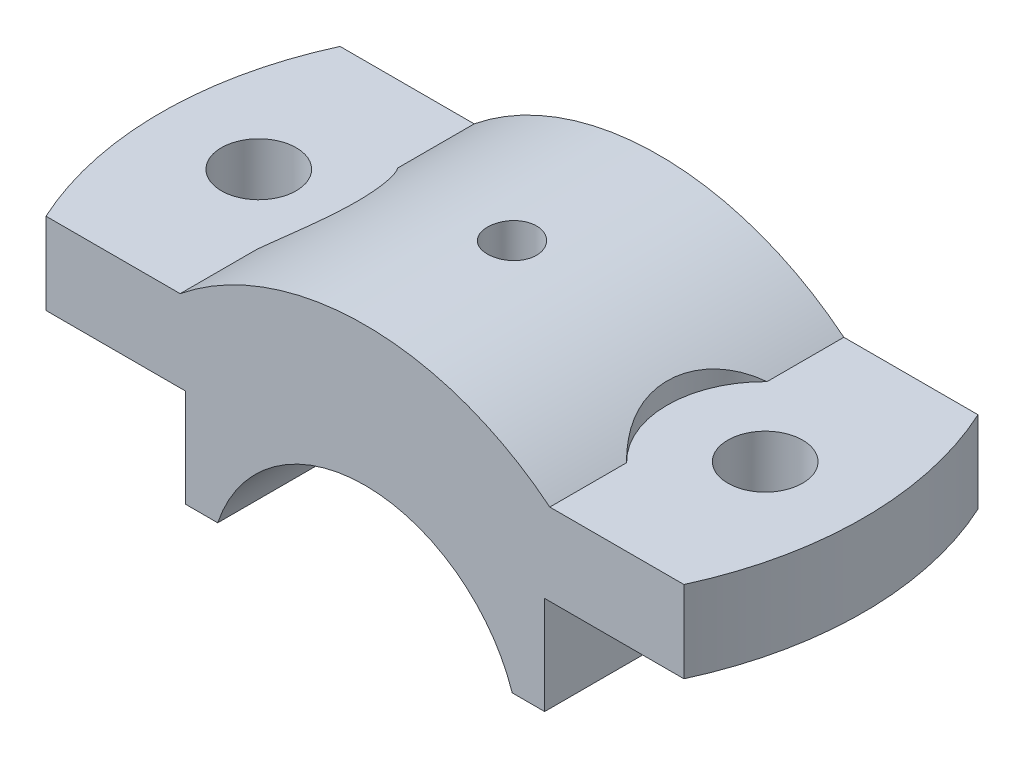
ISO-10303-21;
HEADER;
FILE_DESCRIPTION(('STEP AP214'),'2;1');
FILE_NAME('part.step','',(''),(''),'','','');
FILE_SCHEMA(('AUTOMOTIVE_DESIGN { 1 0 10303 214 1 1 1 1 }'));
ENDSEC;
DATA;
#1=APPLICATION_CONTEXT('core data for automotive mechanical design processes');
#2=APPLICATION_PROTOCOL_DEFINITION('international standard','automotive_design',2000,#1);
#3=PRODUCT_CONTEXT('',#1,'mechanical');
#4=PRODUCT('Part','Part','',(#3));
#5=PRODUCT_RELATED_PRODUCT_CATEGORY('part','',(#4));
#6=PRODUCT_DEFINITION_FORMATION('','',#4);
#7=PRODUCT_DEFINITION_CONTEXT('part definition',#1,'design');
#8=PRODUCT_DEFINITION('design','',#6,#7);
#9=PRODUCT_DEFINITION_SHAPE('','',#8);
#10=(LENGTH_UNIT() NAMED_UNIT(*) SI_UNIT(.MILLI.,.METRE.));
#11=(NAMED_UNIT(*) PLANE_ANGLE_UNIT() SI_UNIT($,.RADIAN.));
#12=(NAMED_UNIT(*) SI_UNIT($,.STERADIAN.) SOLID_ANGLE_UNIT());
#13=UNCERTAINTY_MEASURE_WITH_UNIT(LENGTH_MEASURE(1.E-05),#10,'distance_accuracy_value','');
#14=(GEOMETRIC_REPRESENTATION_CONTEXT(3) GLOBAL_UNCERTAINTY_ASSIGNED_CONTEXT((#13)) GLOBAL_UNIT_ASSIGNED_CONTEXT((#10,
#11,#12)) REPRESENTATION_CONTEXT('',''));
#15=CARTESIAN_POINT('',(0.,0.,0.));
#16=DIRECTION('',(0.,0.,1.));
#17=DIRECTION('',(1.,0.,0.));
#18=AXIS2_PLACEMENT_3D('',#15,#16,#17);
#19=CARTESIAN_POINT('',(0.,-19.,18.));
#20=DIRECTION('',(0.,0.,-1.));
#21=DIRECTION('',(-1.,0.,0.));
#22=AXIS2_PLACEMENT_3D('',#19,#20,#21);
#23=CYLINDRICAL_SURFACE('',#22,36.);
#24=CARTESIAN_POINT('',(0.,17.,3.));
#25=CARTESIAN_POINT('',(-0.168198269763613,16.9999983623455,2.99999265352116));
#26=CARTESIAN_POINT('',(-0.336511041540677,16.9988086563019,2.98580709056686));
#27=CARTESIAN_POINT('',(-0.668479712101169,16.9941770698475,2.92942694443476));
#28=CARTESIAN_POINT('',(-0.832130115675691,16.9907326379509,2.88720062908529));
#29=CARTESIAN_POINT('',(-1.14991806754278,16.9819808373831,2.7759685385719));
#30=CARTESIAN_POINT('',(-1.30406094127385,16.9766745229546,2.70697791567055));
#31=CARTESIAN_POINT('',(-1.59854170024823,16.9647940323414,2.54420270438402));
#32=CARTESIAN_POINT('',(-1.73888252965617,16.9582201274407,2.45042341956747));
#33=CARTESIAN_POINT('',(-2.00216999989677,16.9445233960014,2.24047480018201));
#34=CARTESIAN_POINT('',(-2.12507661724848,16.9373993625973,2.12425534819294));
#35=CARTESIAN_POINT('',(-2.34966340060966,16.9234154240951,1.8728313124502));
#36=CARTESIAN_POINT('',(-2.45134263411452,16.9165555306112,1.73762589509213));
#37=CARTESIAN_POINT('',(-2.63072376717069,16.9038635798373,1.45182564870291));
#38=CARTESIAN_POINT('',(-2.70839049885463,16.8980330354028,1.30120867379168));
#39=CARTESIAN_POINT('',(-2.83731730132153,16.8880737334482,0.989015113332052));
#40=CARTESIAN_POINT('',(-2.88857783853725,16.883944945869,0.827438721425248));
#41=CARTESIAN_POINT('',(-2.96312108945571,16.8778667619897,0.498313824356467));
#42=CARTESIAN_POINT('',(-2.98646899616932,16.8759122880866,0.330780180022194));
#43=CARTESIAN_POINT('',(-3.00472562404628,16.8743879696443,-0.00583861183609764));
#44=CARTESIAN_POINT('',(-2.99963487893862,16.8748180803518,-0.174923730183009));
#45=CARTESIAN_POINT('',(-2.96121259264454,16.8780097208491,-0.509398996531564));
#46=CARTESIAN_POINT('',(-2.92795190411417,16.8807654013356,-0.674797347229238));
#47=CARTESIAN_POINT('',(-2.83424395614882,16.888288507081,-0.99765560217886));
#48=CARTESIAN_POINT('',(-2.77379643119035,16.893055951988,-1.15511542888156));
#49=CARTESIAN_POINT('',(-2.6273513644561,16.9040721412056,-1.45785271763429));
#50=CARTESIAN_POINT('',(-2.54132203427158,16.9103227265289,-1.60311473276253));
#51=CARTESIAN_POINT('',(-2.34617833174004,16.9235992059164,-1.87716401645942));
#52=CARTESIAN_POINT('',(-2.23706349186763,16.9306251156809,-2.00595095129165));
#53=CARTESIAN_POINT('',(-1.99844874667909,16.9446866123494,-2.2438062578447));
#54=CARTESIAN_POINT('',(-1.86888758817172,16.951722163252,-2.35281319238775));
#55=CARTESIAN_POINT('',(-1.59327166911525,16.964989756095,-2.54753917016566));
#56=CARTESIAN_POINT('',(-1.44721689754601,16.9712217974986,-2.63325819784067));
#57=CARTESIAN_POINT('',(-1.14271977980355,16.9821813742892,-2.77897128800612));
#58=CARTESIAN_POINT('',(-0.984276125427222,16.9869087505233,-2.83896262943447));
#59=CARTESIAN_POINT('',(-0.659517207058746,16.9943245223539,-2.93147439735398));
#60=CARTESIAN_POINT('',(-0.493202106506565,16.9970129602666,-2.96399539396579));
#61=CARTESIAN_POINT('',(-0.157953900492752,17.0000425082915,-3.00056629212474));
#62=CARTESIAN_POINT('',(0.0109698873455888,17.0003906147601,-3.00470105432069));
#63=CARTESIAN_POINT('',(0.347108257509911,16.998718963361,-2.98460441811805));
#64=CARTESIAN_POINT('',(0.51432285576424,16.9966992275802,-2.96037328431162));
#65=CARTESIAN_POINT('',(0.842054268674099,16.9905235352396,-2.88430302416972));
#66=CARTESIAN_POINT('',(1.00258027541917,16.9863706225226,-2.83250323192257));
#67=CARTESIAN_POINT('',(1.31266249524747,16.9763951033705,-2.70280623665391));
#68=CARTESIAN_POINT('',(1.4622185348494,16.9705724705373,-2.6249086210245));
#69=CARTESIAN_POINT('',(1.74650165490572,16.957892791809,-2.44501395235093));
#70=CARTESIAN_POINT('',(1.88119305156441,16.9510333465621,-2.34296068081552));
#71=CARTESIAN_POINT('',(2.13156328453086,16.9370587591909,-2.11773282884855));
#72=CARTESIAN_POINT('',(2.24724179044315,16.9299436126258,-1.9945578814522));
#73=CARTESIAN_POINT('',(2.45659363636531,16.9162388364747,-1.73021492340498));
#74=CARTESIAN_POINT('',(2.55021159970092,16.9096505562267,-1.5890029764078));
#75=CARTESIAN_POINT('',(2.71240518851855,16.8977645523296,-1.29281321140975));
#76=CARTESIAN_POINT('',(2.78098106402989,16.8924668157955,-1.13783553087018));
#77=CARTESIAN_POINT('',(2.89104953232169,16.8837692854682,-0.818709628382284));
#78=CARTESIAN_POINT('',(2.93257602434787,16.880367116859,-0.654573165857006));
#79=CARTESIAN_POINT('',(2.98747730973046,16.8758379707255,-0.321627900376726));
#80=CARTESIAN_POINT('',(3.0008526437048,16.8747109495091,-0.152819187211215));
#81=CARTESIAN_POINT('',(2.99906568867279,16.8748603385058,0.184128378062687));
#82=CARTESIAN_POINT('',(2.98399040933217,16.8761294207921,0.352267701709314));
#83=CARTESIAN_POINT('',(2.92591158988509,16.8809124524692,0.683617600652554));
#84=CARTESIAN_POINT('',(2.88290800718288,16.8844264052839,0.84682816843152));
#85=CARTESIAN_POINT('',(2.77021533005119,16.8933013139512,1.16369328979986));
#86=CARTESIAN_POINT('',(2.7005278020196,16.8986621613857,1.31734840369706));
#87=CARTESIAN_POINT('',(2.53645517684175,16.9106269962521,1.610792521721));
#88=CARTESIAN_POINT('',(2.44207046734367,16.9172309641714,1.75058174343998));
#89=CARTESIAN_POINT('',(2.23095582636734,16.9309619509604,2.01277121703903));
#90=CARTESIAN_POINT('',(2.11416148122438,16.9380904401723,2.13511952597204));
#91=CARTESIAN_POINT('',(1.86165967677739,16.9520538502904,2.35852555560996));
#92=CARTESIAN_POINT('',(1.72594764792327,16.9588886997447,2.45957811748805));
#93=CARTESIAN_POINT('',(1.43920131908824,16.9715070452682,2.63765958125269));
#94=CARTESIAN_POINT('',(1.28813896881161,16.9772885606931,2.71464341596898));
#95=CARTESIAN_POINT('',(0.975287255987198,16.987125575489,2.84205540915384));
#96=CARTESIAN_POINT('',(0.813510466240951,16.9911830578477,2.89251409286432));
#97=CARTESIAN_POINT('',(0.542316144290037,16.9960732320155,2.95259274750614));
#98=CARTESIAN_POINT('',(0.43464268331541,16.9975390663086,2.97034683755247));
#99=CARTESIAN_POINT('',(0.217995514503486,16.999502979759,2.99405282903161));
#100=CARTESIAN_POINT('',(0.109021810119134,17.0000010614857,3.00000476179941));
#101=CARTESIAN_POINT('',(0.,17.,3.));
#102=B_SPLINE_CURVE_WITH_KNOTS('',3,(#24,#25,#26,#27,#28,#29,#30,#31,#32,#33,#34,#35,#36,#37,
#38,#39,#40,#41,#42,#43,#44,#45,#46,#47,#48,#49,#50,#51,#52,#53,#54,#55,#56,#57,#58,#59,#60,#61,
#62,#63,#64,#65,#66,#67,#68,#69,#70,#71,#72,#73,#74,#75,#76,#77,#78,#79,#80,#81,#82,#83,#84,#85,
#86,#87,#88,#89,#90,#91,#92,#93,#94,#95,#96,#97,#98,#99,#100,#101),.UNSPECIFIED.,.T.,.F.,(4,2,2,
2,2,2,2,2,2,2,2,2,2,2,2,2,2,2,2,2,2,2,2,2,2,2,2,2,2,2,2,2,2,2,2,2,2,2,4),(0.,0.504196760400417,
1.00896506699351,1.51344802166686,2.01782312875254,2.52333800635729,3.02887508621795,
3.53514908853274,4.04141414783703,4.54649444494759,5.05156526287857,5.55536949330869,
6.05917864430997,6.56361647246698,7.0680645174258,7.57405352805448,8.08004287675934,
8.58608572771351,9.09211807597605,9.59663697921506,10.1011511764266,10.6049474709236,
11.1087517308412,11.6137402492478,12.1187375421375,12.6249892947361,13.1312359925948,
13.6368470172279,14.1424483319627,14.6465058864758,15.1505642097702,15.6545929484257,
16.1586137762957,16.6641056599392,17.1697198569744,17.6762751918766,18.1822462977536,
18.5090545906999,18.8358620159624),.UNSPECIFIED.);
#103=CARTESIAN_POINT('',(0.,17.,3.));
#104=VERTEX_POINT('',#103);
#105=EDGE_CURVE('E12',#104,#104,#102,.T.);
#106=ORIENTED_EDGE('',*,*,#105,.T.);
#107=EDGE_LOOP('',(#106));
#108=FACE_BOUND('',#107,.T.);
#109=CARTESIAN_POINT('',(-22.6274169979695,8.99999999999999,8.59337023312926));
#110=CARTESIAN_POINT('',(-22.4323020377035,9.15770103038517,8.40332361079073));
#111=CARTESIAN_POINT('',(-22.2409672164458,9.30892675659083,8.20389961009321));
#112=CARTESIAN_POINT('',(-21.8681145773808,9.59791732158841,7.78671256886573));
#113=CARTESIAN_POINT('',(-21.686602145838,9.73567480759426,7.56893963045307));
#114=CARTESIAN_POINT('',(-21.335424923114,9.99737627889387,7.11510533494271));
#115=CARTESIAN_POINT('',(-21.1657912246189,10.1212844839164,6.87899916090791));
#116=CARTESIAN_POINT('',(-20.8412794940323,10.3544028545234,6.39004040968228));
#117=CARTESIAN_POINT('',(-20.6863986754628,10.4636157973175,6.13719101025455));
#118=CARTESIAN_POINT('',(-20.3930805972417,10.6673945383296,5.61510434153096));
#119=CARTESIAN_POINT('',(-20.254705932235,10.7619049693274,5.34581020154524));
#120=CARTESIAN_POINT('',(-19.9971626484115,10.9355579229168,4.79339154830518));
#121=CARTESIAN_POINT('',(-19.8779954688237,11.014699293986,4.51026600072419));
#122=CARTESIAN_POINT('',(-19.6609097170449,11.1573455166117,3.93271050943543));
#123=CARTESIAN_POINT('',(-19.5629574655434,11.2208751741242,3.63829936972604));
#124=CARTESIAN_POINT('',(-19.3896076627572,11.3323879083536,3.04005208816817));
#125=CARTESIAN_POINT('',(-19.3142084052037,11.3803721611964,2.73621666124398));
#126=CARTESIAN_POINT('',(-19.19108708929,11.4582852979445,2.14065405031052));
#127=CARTESIAN_POINT('',(-19.1419399628041,11.4891484476322,1.84934258858535));
#128=CARTESIAN_POINT('',(-19.0652179392428,11.5371826320701,1.2627784342351));
#129=CARTESIAN_POINT('',(-19.0376422820532,11.5543541492732,0.967525880855281));
#130=CARTESIAN_POINT('',(-19.0044417350915,11.5750155819116,0.375193052705737));
#131=CARTESIAN_POINT('',(-18.9988257690714,11.5784999353017,0.0781120840294408));
#132=CARTESIAN_POINT('',(-19.0096479738256,11.5717733571517,-0.515490882076435));
#133=CARTESIAN_POINT('',(-19.0260858170253,11.5615626290305,-0.812012887743021));
#134=CARTESIAN_POINT('',(-19.0798854563829,11.5280023986573,-1.39255450329964));
#135=CARTESIAN_POINT('',(-19.1165435736388,11.50509463797,-1.67666527978511));
#136=CARTESIAN_POINT('',(-19.2097910626555,11.4464604968196,-2.24024684656919));
#137=CARTESIAN_POINT('',(-19.2663799084814,11.4107344546067,-2.51971775910146));
#138=CARTESIAN_POINT('',(-19.3987244028512,11.3264840246874,-3.07199714482626));
#139=CARTESIAN_POINT('',(-19.4744729165682,11.2779644008699,-3.34480805674543));
#140=CARTESIAN_POINT('',(-19.6441602685364,11.1681482759089,-3.88206436777503));
#141=CARTESIAN_POINT('',(-19.7380990781002,11.1068517949154,-4.14650978007758));
#142=CARTESIAN_POINT('',(-19.9440381230947,10.9708311545791,-4.66811676469057));
#143=CARTESIAN_POINT('',(-20.0562187233289,10.8959719501222,-4.92517184104498));
#144=CARTESIAN_POINT('',(-20.2964661342034,10.7333901526991,-5.42752729888821));
#145=CARTESIAN_POINT('',(-20.4245339564462,10.645666740553,-5.67282693048118));
#146=CARTESIAN_POINT('',(-20.6949566664005,10.4575268356823,-6.15041122627124));
#147=CARTESIAN_POINT('',(-20.8373150097059,10.3571072713679,-6.38269272128765));
#148=CARTESIAN_POINT('',(-21.1344883115375,10.1438989248369,-6.83305433090923));
#149=CARTESIAN_POINT('',(-21.2893004878411,10.0311129032902,-7.05113759785105));
#150=CARTESIAN_POINT('',(-21.6338337672899,9.77550813546387,-7.50425353527947));
#151=CARTESIAN_POINT('',(-21.8252948316158,9.63072656374516,-7.736867214541));
#152=CARTESIAN_POINT('',(-22.120632533989,9.40234283341371,-8.07000459877512));
#153=CARTESIAN_POINT('',(-22.220302245267,9.32445409032998,-8.17829024018718));
#154=CARTESIAN_POINT('',(-22.4220958340157,9.16498114963709,-8.38969961746407));
#155=CARTESIAN_POINT('',(-22.5242193974326,9.08339742375647,-8.49282400873301));
#156=CARTESIAN_POINT('',(-22.6274169979695,8.99999999999999,-8.59337023312926));
#157=B_SPLINE_CURVE_WITH_KNOTS('',3,(#109,#110,#111,#112,#113,#114,#115,#116,#117,#118,#119,
#120,#121,#122,#123,#124,#125,#126,#127,#128,#129,#130,#131,#132,#133,#134,#135,#136,#137,#138,
#139,#140,#141,#142,#143,#144,#145,#146,#147,#148,#149,#150,#151,#152,#153,#154,#155,#156),
.UNSPECIFIED.,.F.,.F.,(4,2,2,2,2,2,2,2,2,2,2,2,2,2,2,2,2,2,2,2,2,2,2,4),(0.,0.944085832178336,
1.88868422919986,2.83566922749357,3.78247500606206,4.73276421628001,5.6831245991925,
6.63196501545618,7.58073362809563,8.4707346614709,9.36070433244542,10.2510356225207,
11.1413536882697,12.0024819160299,12.8635874219137,13.7243727334926,14.5851566875723,
15.4550364955656,16.324971720713,17.1951178141404,18.0650700513922,19.0664887963157,
19.565910614532,20.065268851649),.UNSPECIFIED.);
#158=CARTESIAN_POINT('',(-22.6274169979695,8.99999999999999,8.59337023312926));
#159=VERTEX_POINT('',#158);
#160=CARTESIAN_POINT('',(-22.6274169979695,8.99999999999999,-8.59337023312926));
#161=VERTEX_POINT('',#160);
#162=EDGE_CURVE('E58',#159,#161,#157,.T.);
#163=ORIENTED_EDGE('',*,*,#162,.F.);
#164=DIRECTION('',(0.,0.,-1.));
#165=VECTOR('',#164,1.);
#166=CARTESIAN_POINT('',(-22.6274169979695,8.99999999999999,18.));
#167=LINE('',#166,#165);
#168=CARTESIAN_POINT('',(-22.6274169979695,8.99999999999999,18.));
#169=VERTEX_POINT('',#168);
#170=EDGE_CURVE('E159',#169,#159,#167,.T.);
#171=ORIENTED_EDGE('',*,*,#170,.F.);
#172=CARTESIAN_POINT('',(0.,-19.,18.));
#173=DIRECTION('',(0.,0.,1.));
#174=DIRECTION('',(-1.,0.,0.));
#175=AXIS2_PLACEMENT_3D('',#172,#173,#174);
#176=CIRCLE('',#175,36.);
#177=CARTESIAN_POINT('',(22.6274169979695,8.99999999999999,18.));
#178=VERTEX_POINT('',#177);
#179=EDGE_CURVE('E358',#178,#169,#176,.T.);
#180=ORIENTED_EDGE('',*,*,#179,.F.);
#181=DIRECTION('',(0.,0.,-1.));
#182=VECTOR('',#181,1.);
#183=CARTESIAN_POINT('',(22.6274169979695,8.99999999999999,18.));
#184=LINE('',#183,#182);
#185=CARTESIAN_POINT('',(22.6274169979695,8.99999999999999,8.59337023312925));
#186=VERTEX_POINT('',#185);
#187=EDGE_CURVE('E174',#178,#186,#184,.T.);
#188=ORIENTED_EDGE('',*,*,#187,.T.);
#189=CARTESIAN_POINT('',(22.6274169979695,8.99999999999999,-8.59337023312927));
#190=CARTESIAN_POINT('',(22.4323020377035,9.15770103038517,-8.40332361079075));
#191=CARTESIAN_POINT('',(22.2409672164458,9.30892675659083,-8.20389961009323));
#192=CARTESIAN_POINT('',(21.8681145773808,9.59791732158841,-7.78671256886575));
#193=CARTESIAN_POINT('',(21.686602145838,9.73567480759427,-7.56893963045309));
#194=CARTESIAN_POINT('',(21.335424923114,9.99737627889387,-7.11510533494273));
#195=CARTESIAN_POINT('',(21.1657912246189,10.1212844839164,-6.87899916090793));
#196=CARTESIAN_POINT('',(20.8412794940323,10.3544028545234,-6.3900404096823));
#197=CARTESIAN_POINT('',(20.6863986754628,10.4636157973175,-6.13719101025457));
#198=CARTESIAN_POINT('',(20.3930805972417,10.6673945383296,-5.61510434153098));
#199=CARTESIAN_POINT('',(20.254705932235,10.7619049693274,-5.34581020154526));
#200=CARTESIAN_POINT('',(19.9971626484115,10.9355579229168,-4.79339154830519));
#201=CARTESIAN_POINT('',(19.8779954688237,11.014699293986,-4.51026600072421));
#202=CARTESIAN_POINT('',(19.6609097170449,11.1573455166117,-3.93271050943544));
#203=CARTESIAN_POINT('',(19.5629574655434,11.2208751741242,-3.63829936972605));
#204=CARTESIAN_POINT('',(19.3896076627572,11.3323879083536,-3.04005208816818));
#205=CARTESIAN_POINT('',(19.3142084052037,11.3803721611964,-2.736216661244));
#206=CARTESIAN_POINT('',(19.19108708929,11.4582852979445,-2.14065405031054));
#207=CARTESIAN_POINT('',(19.1419399628041,11.4891484476322,-1.84934258858536));
#208=CARTESIAN_POINT('',(19.0652179392428,11.5371826320701,-1.26277843423512));
#209=CARTESIAN_POINT('',(19.0376422820532,11.5543541492732,-0.967525880855294));
#210=CARTESIAN_POINT('',(19.0044417350915,11.5750155819116,-0.375193052705747));
#211=CARTESIAN_POINT('',(18.9988257690714,11.5784999353017,-0.0781120840294504));
#212=CARTESIAN_POINT('',(19.0096479738256,11.5717733571517,0.515490882076427));
#213=CARTESIAN_POINT('',(19.0260858170253,11.5615626290305,0.812012887743013));
#214=CARTESIAN_POINT('',(19.0798854563829,11.5280023986573,1.39255450329963));
#215=CARTESIAN_POINT('',(19.1165435736387,11.50509463797,1.67666527978511));
#216=CARTESIAN_POINT('',(19.2097910626555,11.4464604968196,2.24024684656919));
#217=CARTESIAN_POINT('',(19.2663799084814,11.4107344546067,2.51971775910146));
#218=CARTESIAN_POINT('',(19.3987244028512,11.3264840246874,3.07199714482625));
#219=CARTESIAN_POINT('',(19.4744729165682,11.2779644008699,3.34480805674543));
#220=CARTESIAN_POINT('',(19.6441602685364,11.1681482759089,3.88206436777502));
#221=CARTESIAN_POINT('',(19.7380990781002,11.1068517949154,4.14650978007757));
#222=CARTESIAN_POINT('',(19.9440381230947,10.9708311545791,4.66811676469057));
#223=CARTESIAN_POINT('',(20.0562187233289,10.8959719501222,4.92517184104498));
#224=CARTESIAN_POINT('',(20.2964661342034,10.7333901526991,5.42752729888821));
#225=CARTESIAN_POINT('',(20.4245339564462,10.645666740553,5.67282693048118));
#226=CARTESIAN_POINT('',(20.6949566664005,10.4575268356823,6.15041122627124));
#227=CARTESIAN_POINT('',(20.8373150097059,10.3571072713679,6.38269272128765));
#228=CARTESIAN_POINT('',(21.1344883115375,10.1438989248369,6.83305433090923));
#229=CARTESIAN_POINT('',(21.2893004878411,10.0311129032902,7.05113759785105));
#230=CARTESIAN_POINT('',(21.6338337672899,9.77550813546387,7.50425353527946));
#231=CARTESIAN_POINT('',(21.8252948316158,9.63072656374516,7.736867214541));
#232=CARTESIAN_POINT('',(22.120632533989,9.40234283341371,8.07000459877512));
#233=CARTESIAN_POINT('',(22.220302245267,9.32445409032999,8.17829024018718));
#234=CARTESIAN_POINT('',(22.4220958340157,9.16498114963709,8.38969961746406));
#235=CARTESIAN_POINT('',(22.5242193974326,9.08339742375647,8.492824008733));
#236=CARTESIAN_POINT('',(22.6274169979695,8.99999999999999,8.59337023312925));
#237=B_SPLINE_CURVE_WITH_KNOTS('',3,(#189,#190,#191,#192,#193,#194,#195,#196,#197,#198,#199,
#200,#201,#202,#203,#204,#205,#206,#207,#208,#209,#210,#211,#212,#213,#214,#215,#216,#217,#218,
#219,#220,#221,#222,#223,#224,#225,#226,#227,#228,#229,#230,#231,#232,#233,#234,#235,#236),
.UNSPECIFIED.,.F.,.F.,(4,2,2,2,2,2,2,2,2,2,2,2,2,2,2,2,2,2,2,2,2,2,2,4),(0.,0.944085832178336,
1.88868422919986,2.83566922749357,3.78247500606207,4.73276421628001,5.68312459919251,
6.63196501545619,7.58073362809564,8.47073466147091,9.36070433244543,10.2510356225207,
11.1413536882697,12.0024819160299,12.8635874219138,13.7243727334926,14.5851566875724,
15.4550364955656,16.324971720713,17.1951178141404,18.0650700513922,19.0664887963157,
19.565910614532,20.065268851649),.UNSPECIFIED.);
#238=CARTESIAN_POINT('',(22.6274169979695,8.99999999999998,-8.59337023312927));
#239=VERTEX_POINT('',#238);
#240=EDGE_CURVE('E164',#239,#186,#237,.T.);
#241=ORIENTED_EDGE('',*,*,#240,.F.);
#242=CARTESIAN_POINT('',(22.6274169979695,8.99999999999999,-18.));
#243=VERTEX_POINT('',#242);
#244=EDGE_CURVE('E170',#239,#243,#184,.T.);
#245=ORIENTED_EDGE('',*,*,#244,.T.);
#246=CARTESIAN_POINT('',(0.,-19.,-18.));
#247=DIRECTION('',(0.,0.,1.));
#248=DIRECTION('',(-1.,0.,0.));
#249=AXIS2_PLACEMENT_3D('',#246,#247,#248);
#250=CIRCLE('',#249,36.);
#251=CARTESIAN_POINT('',(-22.6274169979695,8.99999999999999,-18.));
#252=VERTEX_POINT('',#251);
#253=EDGE_CURVE('E390',#243,#252,#250,.T.);
#254=ORIENTED_EDGE('',*,*,#253,.T.);
#255=EDGE_CURVE('E162',#161,#252,#167,.T.);
#256=ORIENTED_EDGE('',*,*,#255,.F.);
#257=EDGE_LOOP('',(#163,#171,#180,#188,#241,#245,#254,#256));
#258=FACE_BOUND('',#257,.T.);
#259=ADVANCED_FACE('F44',(#108,#258),#23,.T.);
#260=CARTESIAN_POINT('',(21.9977563773199,-1.00000000000001,18.));
#261=DIRECTION('',(0.,1.,0.));
#262=DIRECTION('',(0.,0.,1.));
#263=AXIS2_PLACEMENT_3D('',#260,#261,#262);
#264=PLANE('',#263);
#265=CARTESIAN_POINT('',(31.,-1.00000000000001,0.));
#266=DIRECTION('',(0.,1.,0.));
#267=DIRECTION('',(0.,0.,1.));
#268=AXIS2_PLACEMENT_3D('',#265,#266,#267);
#269=CIRCLE('',#268,4.57770557858712);
#270=CARTESIAN_POINT('',(31.,-1.00000000000001,4.57770557858712));
#271=VERTEX_POINT('',#270);
#272=EDGE_CURVE('E206',#271,#271,#269,.T.);
#273=ORIENTED_EDGE('',*,*,#272,.T.);
#274=EDGE_LOOP('',(#273));
#275=FACE_BOUND('',#274,.T.);
#276=CARTESIAN_POINT('',(0.,-1.00000000000001,0.));
#277=DIRECTION('',(0.,1.,0.));
#278=DIRECTION('',(0.,0.,1.));
#279=AXIS2_PLACEMENT_3D('',#276,#277,#278);
#280=CIRCLE('',#279,42.9977563773199);
#281=CARTESIAN_POINT('',(39.0487778743888,-1.00000000000001,18.));
#282=VERTEX_POINT('',#281);
#283=CARTESIAN_POINT('',(39.0487778743888,-1.00000000000001,-18.));
#284=VERTEX_POINT('',#283);
#285=EDGE_CURVE('E327',#282,#284,#280,.T.);
#286=ORIENTED_EDGE('',*,*,#285,.F.);
#287=DIRECTION('',(1.,0.,0.));
#288=VECTOR('',#287,1.);
#289=CARTESIAN_POINT('',(21.9977563773199,-1.00000000000001,18.));
#290=LINE('',#289,#288);
#291=CARTESIAN_POINT('',(21.9977563773199,-1.00000000000001,18.));
#292=VERTEX_POINT('',#291);
#293=EDGE_CURVE('E351',#292,#282,#290,.T.);
#294=ORIENTED_EDGE('',*,*,#293,.F.);
#295=DIRECTION('',(0.,0.,-1.));
#296=VECTOR('',#295,1.);
#297=CARTESIAN_POINT('',(21.9977563773199,-1.00000000000001,18.));
#298=LINE('',#297,#296);
#299=CARTESIAN_POINT('',(21.9977563773199,-1.00000000000001,-18.));
#300=VERTEX_POINT('',#299);
#301=EDGE_CURVE('E182',#292,#300,#298,.T.);
#302=ORIENTED_EDGE('',*,*,#301,.T.);
#303=DIRECTION('',(1.,0.,0.));
#304=VECTOR('',#303,1.);
#305=CARTESIAN_POINT('',(21.9977563773199,-1.00000000000001,-18.));
#306=LINE('',#305,#304);
#307=EDGE_CURVE('E382',#300,#284,#306,.T.);
#308=ORIENTED_EDGE('',*,*,#307,.T.);
#309=EDGE_LOOP('',(#286,#294,#302,#308));
#310=FACE_BOUND('',#309,.T.);
#311=ADVANCED_FACE('F267',(#275,#310),#264,.F.);
#312=CARTESIAN_POINT('',(42.9977563773199,8.99999999999999,18.));
#313=DIRECTION('',(0.,-1.,0.));
#314=DIRECTION('',(1.,0.,0.));
#315=AXIS2_PLACEMENT_3D('',#312,#313,#314);
#316=PLANE('',#315);
#317=CARTESIAN_POINT('',(31.,8.99999999999998,0.));
#318=DIRECTION('',(0.,1.,0.));
#319=DIRECTION('',(1.,0.,0.));
#320=AXIS2_PLACEMENT_3D('',#317,#318,#319);
#321=CIRCLE('',#320,4.57770557858712);
#322=CARTESIAN_POINT('',(35.5777055785871,8.99999999999998,0.));
#323=VERTEX_POINT('',#322);
#324=EDGE_CURVE('E154',#323,#323,#321,.T.);
#325=ORIENTED_EDGE('',*,*,#324,.F.);
#326=EDGE_LOOP('',(#325));
#327=FACE_BOUND('',#326,.T.);
#328=CARTESIAN_POINT('',(0.,8.99999999999999,0.));
#329=DIRECTION('',(0.,1.,0.));
#330=DIRECTION('',(-1.,0.,0.));
#331=AXIS2_PLACEMENT_3D('',#328,#329,#330);
#332=CIRCLE('',#331,42.9977563773199);
#333=CARTESIAN_POINT('',(39.0487778743888,8.99999999999998,18.));
#334=VERTEX_POINT('',#333);
#335=CARTESIAN_POINT('',(39.0487778743888,8.99999999999998,-18.));
#336=VERTEX_POINT('',#335);
#337=EDGE_CURVE('E323',#334,#336,#332,.T.);
#338=ORIENTED_EDGE('',*,*,#337,.T.);
#339=DIRECTION('',(-1.,0.,0.));
#340=VECTOR('',#339,1.);
#341=CARTESIAN_POINT('',(42.9977563773199,8.99999999999999,-18.));
#342=LINE('',#341,#340);
#343=EDGE_CURVE('E386',#336,#243,#342,.T.);
#344=ORIENTED_EDGE('',*,*,#343,.T.);
#345=ORIENTED_EDGE('',*,*,#244,.F.);
#346=CARTESIAN_POINT('',(31.,8.99999999999998,0.));
#347=DIRECTION('',(0.,1.,0.));
#348=DIRECTION('',(1.,0.,0.));
#349=AXIS2_PLACEMENT_3D('',#346,#347,#348);
#350=CIRCLE('',#349,11.9977563773199);
#351=EDGE_CURVE('E65',#239,#186,#350,.T.);
#352=ORIENTED_EDGE('',*,*,#351,.T.);
#353=ORIENTED_EDGE('',*,*,#187,.F.);
#354=DIRECTION('',(-1.,0.,0.));
#355=VECTOR('',#354,1.);
#356=CARTESIAN_POINT('',(42.9977563773199,8.99999999999999,18.));
#357=LINE('',#356,#355);
#358=EDGE_CURVE('E355',#334,#178,#357,.T.);
#359=ORIENTED_EDGE('',*,*,#358,.F.);
#360=EDGE_LOOP('',(#338,#344,#345,#352,#353,#359));
#361=FACE_BOUND('',#360,.T.);
#362=ADVANCED_FACE('F262',(#327,#361),#316,.F.);
#363=CARTESIAN_POINT('',(-42.9977563773199,8.99999999999999,18.));
#364=DIRECTION('',(0.,-1.,0.));
#365=DIRECTION('',(1.,0.,0.));
#366=AXIS2_PLACEMENT_3D('',#363,#364,#365);
#367=PLANE('',#366);
#368=CARTESIAN_POINT('',(-31.,8.99999999999999,0.));
#369=DIRECTION('',(0.,1.,0.));
#370=DIRECTION('',(-1.,0.,0.));
#371=AXIS2_PLACEMENT_3D('',#368,#369,#370);
#372=CIRCLE('',#371,4.57770557858712);
#373=CARTESIAN_POINT('',(-35.5777055785871,8.99999999999999,0.));
#374=VERTEX_POINT('',#373);
#375=EDGE_CURVE('E207',#374,#374,#372,.T.);
#376=ORIENTED_EDGE('',*,*,#375,.F.);
#377=EDGE_LOOP('',(#376));
#378=FACE_BOUND('',#377,.T.);
#379=CARTESIAN_POINT('',(-39.0487778743888,8.99999999999999,-18.));
#380=VERTEX_POINT('',#379);
#381=CARTESIAN_POINT('',(-39.0487778743888,8.99999999999999,18.));
#382=VERTEX_POINT('',#381);
#383=EDGE_CURVE('E324',#380,#382,#332,.T.);
#384=ORIENTED_EDGE('',*,*,#383,.T.);
#385=DIRECTION('',(-1.,0.,0.));
#386=VECTOR('',#385,1.);
#387=CARTESIAN_POINT('',(-42.9977563773199,8.99999999999999,18.));
#388=LINE('',#387,#386);
#389=EDGE_CURVE('E168',#169,#382,#388,.T.);
#390=ORIENTED_EDGE('',*,*,#389,.F.);
#391=ORIENTED_EDGE('',*,*,#170,.T.);
#392=CARTESIAN_POINT('',(-31.,8.99999999999999,0.));
#393=DIRECTION('',(0.,1.,0.));
#394=DIRECTION('',(-1.,0.,0.));
#395=AXIS2_PLACEMENT_3D('',#392,#393,#394);
#396=CIRCLE('',#395,11.9977563773199);
#397=EDGE_CURVE('E73',#159,#161,#396,.T.);
#398=ORIENTED_EDGE('',*,*,#397,.T.);
#399=ORIENTED_EDGE('',*,*,#255,.T.);
#400=DIRECTION('',(-1.,0.,0.));
#401=VECTOR('',#400,1.);
#402=CARTESIAN_POINT('',(-42.9977563773199,8.99999999999999,-18.));
#403=LINE('',#402,#401);
#404=EDGE_CURVE('E393',#252,#380,#403,.T.);
#405=ORIENTED_EDGE('',*,*,#404,.T.);
#406=EDGE_LOOP('',(#384,#390,#391,#398,#399,#405));
#407=FACE_BOUND('',#406,.T.);
#408=ADVANCED_FACE('F166',(#378,#407),#367,.F.);
#409=CARTESIAN_POINT('',(-21.9977563773199,-1.00000000000001,18.));
#410=DIRECTION('',(0.,1.,0.));
#411=DIRECTION('',(0.,0.,1.));
#412=AXIS2_PLACEMENT_3D('',#409,#410,#411);
#413=PLANE('',#412);
#414=CARTESIAN_POINT('',(-31.,-1.00000000000001,0.));
#415=DIRECTION('',(0.,1.,0.));
#416=DIRECTION('',(0.,0.,1.));
#417=AXIS2_PLACEMENT_3D('',#414,#415,#416);
#418=CIRCLE('',#417,4.57770557858712);
#419=CARTESIAN_POINT('',(-31.,-1.00000000000001,4.57770557858712));
#420=VERTEX_POINT('',#419);
#421=EDGE_CURVE('E202',#420,#420,#418,.T.);
#422=ORIENTED_EDGE('',*,*,#421,.T.);
#423=EDGE_LOOP('',(#422));
#424=FACE_BOUND('',#423,.T.);
#425=CARTESIAN_POINT('',(0.,-1.00000000000001,0.));
#426=DIRECTION('',(0.,1.,0.));
#427=DIRECTION('',(0.,0.,1.));
#428=AXIS2_PLACEMENT_3D('',#425,#426,#427);
#429=CIRCLE('',#428,42.9977563773199);
#430=CARTESIAN_POINT('',(-39.0487778743888,-1.00000000000001,-18.));
#431=VERTEX_POINT('',#430);
#432=CARTESIAN_POINT('',(-39.0487778743888,-1.00000000000001,18.));
#433=VERTEX_POINT('',#432);
#434=EDGE_CURVE('E333',#431,#433,#429,.T.);
#435=ORIENTED_EDGE('',*,*,#434,.F.);
#436=DIRECTION('',(1.,0.,0.));
#437=VECTOR('',#436,1.);
#438=CARTESIAN_POINT('',(-21.9977563773199,-1.00000000000001,-18.));
#439=LINE('',#438,#437);
#440=CARTESIAN_POINT('',(-21.9977563773199,-1.00000000000001,-18.));
#441=VERTEX_POINT('',#440);
#442=EDGE_CURVE('E397',#431,#441,#439,.T.);
#443=ORIENTED_EDGE('',*,*,#442,.T.);
#444=DIRECTION('',(0.,0.,-1.));
#445=VECTOR('',#444,1.);
#446=CARTESIAN_POINT('',(-21.9977563773199,-1.00000000000001,18.));
#447=LINE('',#446,#445);
#448=CARTESIAN_POINT('',(-21.9977563773199,-1.00000000000001,18.));
#449=VERTEX_POINT('',#448);
#450=EDGE_CURVE('E176',#449,#441,#447,.T.);
#451=ORIENTED_EDGE('',*,*,#450,.F.);
#452=DIRECTION('',(1.,0.,0.));
#453=VECTOR('',#452,1.);
#454=CARTESIAN_POINT('',(-21.9977563773199,-1.00000000000001,18.));
#455=LINE('',#454,#453);
#456=EDGE_CURVE('E363',#433,#449,#455,.T.);
#457=ORIENTED_EDGE('',*,*,#456,.F.);
#458=EDGE_LOOP('',(#435,#443,#451,#457));
#459=FACE_BOUND('',#458,.T.);
#460=ADVANCED_FACE('F246',(#424,#459),#413,.F.);
#461=CARTESIAN_POINT('',(0.,-19.,18.));
#462=DIRECTION('',(0.,0.,-1.));
#463=DIRECTION('',(-1.,0.,0.));
#464=AXIS2_PLACEMENT_3D('',#461,#462,#463);
#465=PLANE('',#464);
#466=DIRECTION('',(0.,1.,0.));
#467=VECTOR('',#466,1.);
#468=CARTESIAN_POINT('',(-39.0487778743888,-13.,18.));
#469=LINE('',#468,#467);
#470=EDGE_CURVE('E336',#433,#382,#469,.T.);
#471=ORIENTED_EDGE('',*,*,#470,.F.);
#472=ORIENTED_EDGE('',*,*,#456,.T.);
#473=DIRECTION('',(0.,-1.,0.));
#474=VECTOR('',#473,1.);
#475=CARTESIAN_POINT('',(-21.9977563773199,-13.,18.));
#476=LINE('',#475,#474);
#477=CARTESIAN_POINT('',(-21.9977563773199,-13.,18.));
#478=VERTEX_POINT('',#477);
#479=EDGE_CURVE('E366',#449,#478,#476,.T.);
#480=ORIENTED_EDGE('',*,*,#479,.T.);
#481=DIRECTION('',(1.,0.,0.));
#482=VECTOR('',#481,1.);
#483=CARTESIAN_POINT('',(-18.0277563773199,-13.,18.));
#484=LINE('',#483,#482);
#485=CARTESIAN_POINT('',(-18.0277563773199,-13.,18.));
#486=VERTEX_POINT('',#485);
#487=EDGE_CURVE('E369',#478,#486,#484,.T.);
#488=ORIENTED_EDGE('',*,*,#487,.T.);
#489=CARTESIAN_POINT('',(0.,-19.,18.));
#490=DIRECTION('',(0.,0.,-1.));
#491=DIRECTION('',(-1.,0.,0.));
#492=AXIS2_PLACEMENT_3D('',#489,#490,#491);
#493=CIRCLE('',#492,19.);
#494=CARTESIAN_POINT('',(18.0277563773199,-13.,18.));
#495=VERTEX_POINT('',#494);
#496=EDGE_CURVE('E340',#486,#495,#493,.T.);
#497=ORIENTED_EDGE('',*,*,#496,.T.);
#498=DIRECTION('',(1.,0.,0.));
#499=VECTOR('',#498,1.);
#500=CARTESIAN_POINT('',(18.0277563773199,-13.,18.));
#501=LINE('',#500,#499);
#502=CARTESIAN_POINT('',(21.9977563773199,-13.,18.));
#503=VERTEX_POINT('',#502);
#504=EDGE_CURVE('E344',#495,#503,#501,.T.);
#505=ORIENTED_EDGE('',*,*,#504,.T.);
#506=DIRECTION('',(0.,1.,0.));
#507=VECTOR('',#506,1.);
#508=CARTESIAN_POINT('',(21.9977563773199,-13.,18.));
#509=LINE('',#508,#507);
#510=EDGE_CURVE('E348',#503,#292,#509,.T.);
#511=ORIENTED_EDGE('',*,*,#510,.T.);
#512=ORIENTED_EDGE('',*,*,#293,.T.);
#513=DIRECTION('',(0.,1.,0.));
#514=VECTOR('',#513,1.);
#515=CARTESIAN_POINT('',(39.0487778743888,-13.,18.));
#516=LINE('',#515,#514);
#517=EDGE_CURVE('E330',#334,#282,#516,.F.);
#518=ORIENTED_EDGE('',*,*,#517,.F.);
#519=ORIENTED_EDGE('',*,*,#358,.T.);
#520=ORIENTED_EDGE('',*,*,#179,.T.);
#521=ORIENTED_EDGE('',*,*,#389,.T.);
#522=EDGE_LOOP('',(#471,#472,#480,#488,#497,#505,#511,#512,#518,#519,#520,#521));
#523=FACE_BOUND('',#522,.T.);
#524=ADVANCED_FACE('F242',(#523),#465,.F.);
#525=CARTESIAN_POINT('',(0.,-19.,-18.));
#526=DIRECTION('',(0.,0.,-1.));
#527=DIRECTION('',(-1.,0.,0.));
#528=AXIS2_PLACEMENT_3D('',#525,#526,#527);
#529=PLANE('',#528);
#530=ORIENTED_EDGE('',*,*,#442,.F.);
#531=DIRECTION('',(0.,1.,0.));
#532=VECTOR('',#531,1.);
#533=CARTESIAN_POINT('',(-39.0487778743888,-13.,-18.));
#534=LINE('',#533,#532);
#535=EDGE_CURVE('E198',#431,#380,#534,.T.);
#536=ORIENTED_EDGE('',*,*,#535,.T.);
#537=ORIENTED_EDGE('',*,*,#404,.F.);
#538=ORIENTED_EDGE('',*,*,#253,.F.);
#539=ORIENTED_EDGE('',*,*,#343,.F.);
#540=DIRECTION('',(0.,1.,0.));
#541=VECTOR('',#540,1.);
#542=CARTESIAN_POINT('',(39.0487778743888,-13.,-18.));
#543=LINE('',#542,#541);
#544=EDGE_CURVE('E194',#336,#284,#543,.F.);
#545=ORIENTED_EDGE('',*,*,#544,.T.);
#546=ORIENTED_EDGE('',*,*,#307,.F.);
#547=DIRECTION('',(0.,1.,0.));
#548=VECTOR('',#547,1.);
#549=CARTESIAN_POINT('',(21.9977563773199,-13.,-18.));
#550=LINE('',#549,#548);
#551=CARTESIAN_POINT('',(21.9977563773199,-13.,-18.));
#552=VERTEX_POINT('',#551);
#553=EDGE_CURVE('E379',#552,#300,#550,.T.);
#554=ORIENTED_EDGE('',*,*,#553,.F.);
#555=DIRECTION('',(1.,0.,0.));
#556=VECTOR('',#555,1.);
#557=CARTESIAN_POINT('',(18.0277563773199,-13.,-18.));
#558=LINE('',#557,#556);
#559=CARTESIAN_POINT('',(18.0277563773199,-13.,-18.));
#560=VERTEX_POINT('',#559);
#561=EDGE_CURVE('E376',#560,#552,#558,.T.);
#562=ORIENTED_EDGE('',*,*,#561,.F.);
#563=CARTESIAN_POINT('',(0.,-19.,-18.));
#564=DIRECTION('',(0.,0.,-1.));
#565=DIRECTION('',(-1.,0.,0.));
#566=AXIS2_PLACEMENT_3D('',#563,#564,#565);
#567=CIRCLE('',#566,19.);
#568=CARTESIAN_POINT('',(-18.0277563773199,-13.,-18.));
#569=VERTEX_POINT('',#568);
#570=EDGE_CURVE('E339',#569,#560,#567,.T.);
#571=ORIENTED_EDGE('',*,*,#570,.F.);
#572=DIRECTION('',(1.,0.,0.));
#573=VECTOR('',#572,1.);
#574=CARTESIAN_POINT('',(-18.0277563773199,-13.,-18.));
#575=LINE('',#574,#573);
#576=CARTESIAN_POINT('',(-21.9977563773199,-13.,-18.));
#577=VERTEX_POINT('',#576);
#578=EDGE_CURVE('E345',#577,#569,#575,.T.);
#579=ORIENTED_EDGE('',*,*,#578,.F.);
#580=DIRECTION('',(0.,-1.,0.));
#581=VECTOR('',#580,1.);
#582=CARTESIAN_POINT('',(-21.9977563773199,-13.,-18.));
#583=LINE('',#582,#581);
#584=EDGE_CURVE('E400',#441,#577,#583,.T.);
#585=ORIENTED_EDGE('',*,*,#584,.F.);
#586=EDGE_LOOP('',(#530,#536,#537,#538,#539,#545,#546,#554,#562,#571,#579,#585));
#587=FACE_BOUND('',#586,.T.);
#588=ADVANCED_FACE('F245',(#587),#529,.T.);
#589=CARTESIAN_POINT('',(0.,-19.,18.));
#590=DIRECTION('',(0.,0.,-1.));
#591=DIRECTION('',(-1.,0.,0.));
#592=AXIS2_PLACEMENT_3D('',#589,#590,#591);
#593=CYLINDRICAL_SURFACE('',#592,19.);
#594=CARTESIAN_POINT('',(0.,0.,1.5));
#595=CARTESIAN_POINT('',(-0.0841151387188532,-7.78463034530014E-07,1.49999631934173));
#596=CARTESIAN_POINT('',(-0.168287922827548,-0.000564539964561805,1.49290084958466));
#597=CARTESIAN_POINT('',(-0.334305698598372,-0.00275929359595588,1.46469947465167));
#598=CARTESIAN_POINT('',(-0.416147925046005,-0.00439150254142749,1.44357759491472));
#599=CARTESIAN_POINT('',(-0.575076027563788,-0.00853865683331216,1.38793703178534));
#600=CARTESIAN_POINT('',(-0.652164524677553,-0.0110531105299283,1.35342580876111));
#601=CARTESIAN_POINT('',(-0.799435680795712,-0.0166825793158433,1.27199926981773));
#602=CARTESIAN_POINT('',(-0.869619836810095,-0.01979746378342,1.22508665095823));
#603=CARTESIAN_POINT('',(-1.00127051563137,-0.0262861462245371,1.12007204663659));
#604=CARTESIAN_POINT('',(-1.06271896083146,-0.0296604594612918,1.06194742819675));
#605=CARTESIAN_POINT('',(-1.1749989049417,-0.0362833540197615,0.936206408029782));
#606=CARTESIAN_POINT('',(-1.22582994292754,-0.0395319298779632,0.868589594439193));
#607=CARTESIAN_POINT('',(-1.31549242293151,-0.0455411856292935,0.725675328414236));
#608=CARTESIAN_POINT('',(-1.3543081273485,-0.0483012236310152,0.650367973118573));
#609=CARTESIAN_POINT('',(-1.41873755115466,-0.0530151887646321,0.494279424529938));
#610=CARTESIAN_POINT('',(-1.4443514822562,-0.0549691288235471,0.413498319041156));
#611=CARTESIAN_POINT('',(-1.48159822322927,-0.057845460976273,0.248935339909821));
#612=CARTESIAN_POINT('',(-1.49326029941244,-0.0587700120991077,0.165160128678885));
#613=CARTESIAN_POINT('',(-1.50236268465663,-0.0594897566221514,-0.00316340857498993));
#614=CARTESIAN_POINT('',(-1.49980323578885,-0.0592849692453572,-0.0877117214141512));
#615=CARTESIAN_POINT('',(-1.48055943130006,-0.0577711326987346,-0.254981155017641));
#616=CARTESIAN_POINT('',(-1.46390684932512,-0.0564645675636123,-0.337705956855368));
#617=CARTESIAN_POINT('',(-1.41699882958061,-0.0528982976571182,-0.499182607561632));
#618=CARTESIAN_POINT('',(-1.38674327091875,-0.0506385844149446,-0.57793442111453));
#619=CARTESIAN_POINT('',(-1.31345245016364,-0.0454177809926169,-0.729331074859556));
#620=CARTESIAN_POINT('',(-1.2704028956484,-0.0424559071678309,-0.801968967999394));
#621=CARTESIAN_POINT('',(-1.17275641592226,-0.0361652599825757,-0.938999893955222));
#622=CARTESIAN_POINT('',(-1.11815928117868,-0.03283647996506,-1.00339277713015));
#623=CARTESIAN_POINT('',(-0.998789069552186,-0.026176057130504,-1.12229057948028));
#624=CARTESIAN_POINT('',(-0.933988517197368,-0.0228444314656555,-1.17676791879317));
#625=CARTESIAN_POINT('',(-0.796146882184884,-0.0165624290281593,-1.27407509939559));
#626=CARTESIAN_POINT('',(-0.723105794733444,-0.013612052477298,-1.31690493390936));
#627=CARTESIAN_POINT('',(-0.570838809989569,-0.00842450345802581,-1.38969946273513));
#628=CARTESIAN_POINT('',(-0.491612346167746,-0.00618739641483611,-1.41966297696088));
#629=CARTESIAN_POINT('',(-0.32923160634509,-0.00267922740558904,-1.46585520971452));
#630=CARTESIAN_POINT('',(-0.246077403532175,-0.0014081474465061,-1.48208418405981));
#631=CARTESIAN_POINT('',(-0.0784407393713436,2.24384176068549E-05,-1.50031217220341));
#632=CARTESIAN_POINT('',(0.0060375544804177,0.000184920759149306,-1.50234928955241));
#633=CARTESIAN_POINT('',(0.174134501686998,-0.000612054341249782,-1.49223549471702));
#634=CARTESIAN_POINT('',(0.257753162221241,-0.0015715024054427,-1.48008470112344));
#635=CARTESIAN_POINT('',(0.421648876867876,-0.0045024979066248,-1.44197157489794));
#636=CARTESIAN_POINT('',(0.50193005335941,-0.00647275408249038,-1.41602686183516));
#637=CARTESIAN_POINT('',(0.656999501829892,-0.0112039587905467,-1.35108034355391));
#638=CARTESIAN_POINT('',(0.731787695596671,-0.0139649185784778,-1.31207835246253));
#639=CARTESIAN_POINT('',(0.873921875208903,-0.0199752802166918,-1.22202835520065));
#640=CARTESIAN_POINT('',(0.941251793864614,-0.0232257023030143,-1.17095505784873));
#641=CARTESIAN_POINT('',(1.06639608992058,-0.0298462273077347,-1.05824883025555));
#642=CARTESIAN_POINT('',(1.12421031888409,-0.0332163320920853,-0.99661573532094));
#643=CARTESIAN_POINT('',(1.2288124248757,-0.039705161677334,-0.864374324175829));
#644=CARTESIAN_POINT('',(1.27557547077564,-0.0428233102073849,-0.793746334523398));
#645=CARTESIAN_POINT('',(1.356577619136,-0.0484472186095641,-0.645618147208737));
#646=CARTESIAN_POINT('',(1.39081683559962,-0.0509529840560864,-0.568118012110948));
#647=CARTESIAN_POINT('',(1.44575693555034,-0.0550653139699588,-0.408534049893586));
#648=CARTESIAN_POINT('',(1.46647311943612,-0.0566728943751683,-0.326455517499475));
#649=CARTESIAN_POINT('',(1.49382895011883,-0.0588103254244613,-0.159971925186588));
#650=CARTESIAN_POINT('',(1.50046883646069,-0.0593401944086103,-0.0755669048838357));
#651=CARTESIAN_POINT('',(1.49948094344338,-0.059261978689674,0.0929269294714605));
#652=CARTESIAN_POINT('',(1.49189218322356,-0.0586570060543654,0.177015976500799));
#653=CARTESIAN_POINT('',(1.46274366938462,-0.0563838810115019,0.342721436509555));
#654=CARTESIAN_POINT('',(1.44118389337775,-0.0547157269002605,0.424337845526494));
#655=CARTESIAN_POINT('',(1.38471500507715,-0.0505050097737304,0.582784498435053));
#656=CARTESIAN_POINT('',(1.34980648222261,-0.0479624853684163,0.659614953485354));
#657=CARTESIAN_POINT('',(1.267635548191,-0.0422894644391087,0.806330890474432));
#658=CARTESIAN_POINT('',(1.22037336027397,-0.039158978541262,0.876216497891581));
#659=CARTESIAN_POINT('',(1.11469031191135,-0.0326525908889693,1.007258401442));
#660=CARTESIAN_POINT('',(1.05624065477126,-0.0292760700394898,1.06839144257716));
#661=CARTESIAN_POINT('',(0.929892124489482,-0.0226636820490223,1.18000278065208));
#662=CARTESIAN_POINT('',(0.861990962632758,-0.019427849225954,1.23047848940779));
#663=CARTESIAN_POINT('',(0.718548782250668,-0.0134561934394782,1.31940271283776));
#664=CARTESIAN_POINT('',(0.642994879159653,-0.0107212362630292,1.35783048218647));
#665=CARTESIAN_POINT('',(0.486538032284915,-0.00606990163570282,1.42140600094975));
#666=CARTESIAN_POINT('',(0.405641386546966,-0.00415257956327339,1.44656908316626));
#667=CARTESIAN_POINT('',(0.270219385273124,-0.00184715871106219,1.47646148286017));
#668=CARTESIAN_POINT('',(0.216566049108645,-0.00115760994722713,1.48527676958514));
#669=CARTESIAN_POINT('',(0.108616487728126,-0.000233779764766346,1.49704720975321));
#670=CARTESIAN_POINT('',(0.0543202640171315,5.02719459624163E-07,1.50000237691255));
#671=CARTESIAN_POINT('',(0.,0.,1.5));
#672=B_SPLINE_CURVE_WITH_KNOTS('',3,(#594,#595,#596,#597,#598,#599,#600,#601,#602,#603,#604,
#605,#606,#607,#608,#609,#610,#611,#612,#613,#614,#615,#616,#617,#618,#619,#620,#621,#622,#623,
#624,#625,#626,#627,#628,#629,#630,#631,#632,#633,#634,#635,#636,#637,#638,#639,#640,#641,#642,
#643,#644,#645,#646,#647,#648,#649,#650,#651,#652,#653,#654,#655,#656,#657,#658,#659,#660,#661,
#662,#663,#664,#665,#666,#667,#668,#669,#670,#671),.UNSPECIFIED.,.T.,.F.,(4,2,2,2,2,2,2,2,2,2,2,
2,2,2,2,2,2,2,2,2,2,2,2,2,2,2,2,2,2,2,2,2,2,2,2,2,2,2,4),(0.,0.252147094273371,
0.504581850393633,0.75687615468007,1.00911563499451,1.26186972745745,1.5146347902352,
1.76772953561851,2.02082022208066,2.27337907304911,2.52593362510898,2.77792029301404,
3.02990920041797,3.28218067450636,3.53445672649364,3.78742409874194,4.0403916181499,
4.29338233453675,4.54636833865406,4.79867484092891,5.05097923429394,5.30296211992513,
5.55494859273475,5.80746776930198,6.05999088458261,6.31307611620289,6.56615904395592,
6.81895512684885,7.07174690772234,7.32384647280326,7.57594644186006,7.8280352802507,
8.08011956311296,8.33286165921681,8.58566506452426,8.83890141074389,9.09184439276201,
9.25467749271783,9.4175102115446),.UNSPECIFIED.);
#673=CARTESIAN_POINT('',(0.,0.,1.5));
#674=VERTEX_POINT('',#673);
#675=EDGE_CURVE('E299',#674,#674,#672,.T.);
#676=ORIENTED_EDGE('',*,*,#675,.F.);
#677=EDGE_LOOP('',(#676));
#678=FACE_BOUND('',#677,.T.);
#679=ORIENTED_EDGE('',*,*,#570,.T.);
#680=DIRECTION('',(0.,0.,-1.));
#681=VECTOR('',#680,1.);
#682=CARTESIAN_POINT('',(18.0277563773199,-13.,18.));
#683=LINE('',#682,#681);
#684=EDGE_CURVE('E190',#495,#560,#683,.T.);
#685=ORIENTED_EDGE('',*,*,#684,.F.);
#686=ORIENTED_EDGE('',*,*,#496,.F.);
#687=DIRECTION('',(0.,0.,-1.));
#688=VECTOR('',#687,1.);
#689=CARTESIAN_POINT('',(-18.0277563773199,-13.,18.));
#690=LINE('',#689,#688);
#691=EDGE_CURVE('E372',#486,#569,#690,.T.);
#692=ORIENTED_EDGE('',*,*,#691,.T.);
#693=EDGE_LOOP('',(#679,#685,#686,#692));
#694=FACE_BOUND('',#693,.T.);
#695=ADVANCED_FACE('F46',(#678,#694),#593,.F.);
#696=CARTESIAN_POINT('',(18.0277563773199,-13.,18.));
#697=DIRECTION('',(0.,1.,0.));
#698=DIRECTION('',(0.,0.,1.));
#699=AXIS2_PLACEMENT_3D('',#696,#697,#698);
#700=PLANE('',#699);
#701=ORIENTED_EDGE('',*,*,#561,.T.);
#702=DIRECTION('',(0.,0.,-1.));
#703=VECTOR('',#702,1.);
#704=CARTESIAN_POINT('',(21.9977563773199,-13.,18.));
#705=LINE('',#704,#703);
#706=EDGE_CURVE('E186',#503,#552,#705,.T.);
#707=ORIENTED_EDGE('',*,*,#706,.F.);
#708=ORIENTED_EDGE('',*,*,#504,.F.);
#709=ORIENTED_EDGE('',*,*,#684,.T.);
#710=EDGE_LOOP('',(#701,#707,#708,#709));
#711=FACE_BOUND('',#710,.T.);
#712=ADVANCED_FACE('F447',(#711),#700,.F.);
#713=CARTESIAN_POINT('',(21.9977563773199,-13.,18.));
#714=DIRECTION('',(-1.,0.,0.));
#715=DIRECTION('',(0.,-1.,0.));
#716=AXIS2_PLACEMENT_3D('',#713,#714,#715);
#717=PLANE('',#716);
#718=ORIENTED_EDGE('',*,*,#553,.T.);
#719=ORIENTED_EDGE('',*,*,#301,.F.);
#720=ORIENTED_EDGE('',*,*,#510,.F.);
#721=ORIENTED_EDGE('',*,*,#706,.T.);
#722=EDGE_LOOP('',(#718,#719,#720,#721));
#723=FACE_BOUND('',#722,.T.);
#724=ADVANCED_FACE('F257',(#723),#717,.F.);
#725=CARTESIAN_POINT('',(-21.9977563773199,-13.,18.));
#726=DIRECTION('',(1.,0.,0.));
#727=DIRECTION('',(0.,1.,0.));
#728=AXIS2_PLACEMENT_3D('',#725,#726,#727);
#729=PLANE('',#728);
#730=ORIENTED_EDGE('',*,*,#584,.T.);
#731=DIRECTION('',(0.,0.,-1.));
#732=VECTOR('',#731,1.);
#733=CARTESIAN_POINT('',(-21.9977563773199,-13.,18.));
#734=LINE('',#733,#732);
#735=EDGE_CURVE('E407',#478,#577,#734,.T.);
#736=ORIENTED_EDGE('',*,*,#735,.F.);
#737=ORIENTED_EDGE('',*,*,#479,.F.);
#738=ORIENTED_EDGE('',*,*,#450,.T.);
#739=EDGE_LOOP('',(#730,#736,#737,#738));
#740=FACE_BOUND('',#739,.T.);
#741=ADVANCED_FACE('F253',(#740),#729,.F.);
#742=CARTESIAN_POINT('',(-18.0277563773199,-13.,18.));
#743=DIRECTION('',(0.,1.,0.));
#744=DIRECTION('',(0.,0.,1.));
#745=AXIS2_PLACEMENT_3D('',#742,#743,#744);
#746=PLANE('',#745);
#747=ORIENTED_EDGE('',*,*,#578,.T.);
#748=ORIENTED_EDGE('',*,*,#691,.F.);
#749=ORIENTED_EDGE('',*,*,#487,.F.);
#750=ORIENTED_EDGE('',*,*,#735,.T.);
#751=EDGE_LOOP('',(#747,#748,#749,#750));
#752=FACE_BOUND('',#751,.T.);
#753=ADVANCED_FACE('F240',(#752),#746,.F.);
#754=CARTESIAN_POINT('',(0.,-13.,0.));
#755=DIRECTION('',(0.,1.,0.));
#756=DIRECTION('',(-1.,0.,0.));
#757=AXIS2_PLACEMENT_3D('',#754,#755,#756);
#758=CYLINDRICAL_SURFACE('',#757,42.9977563773199);
#759=ORIENTED_EDGE('',*,*,#285,.T.);
#760=ORIENTED_EDGE('',*,*,#544,.F.);
#761=ORIENTED_EDGE('',*,*,#337,.F.);
#762=ORIENTED_EDGE('',*,*,#517,.T.);
#763=EDGE_LOOP('',(#759,#760,#761,#762));
#764=FACE_BOUND('',#763,.T.);
#765=ADVANCED_FACE('F237',(#764),#758,.T.);
#766=ORIENTED_EDGE('',*,*,#434,.T.);
#767=ORIENTED_EDGE('',*,*,#470,.T.);
#768=ORIENTED_EDGE('',*,*,#383,.F.);
#769=ORIENTED_EDGE('',*,*,#535,.F.);
#770=EDGE_LOOP('',(#766,#767,#768,#769));
#771=FACE_BOUND('',#770,.T.);
#772=ADVANCED_FACE('F232',(#771),#758,.T.);
#773=CARTESIAN_POINT('',(-31.,-13.,0.));
#774=DIRECTION('',(0.,1.,0.));
#775=DIRECTION('',(-1.,0.,0.));
#776=AXIS2_PLACEMENT_3D('',#773,#774,#775);
#777=CYLINDRICAL_SURFACE('',#776,4.57770557858712);
#778=ORIENTED_EDGE('',*,*,#375,.T.);
#779=EDGE_LOOP('',(#778));
#780=FACE_BOUND('',#779,.T.);
#781=ORIENTED_EDGE('',*,*,#421,.F.);
#782=EDGE_LOOP('',(#781));
#783=FACE_BOUND('',#782,.T.);
#784=ADVANCED_FACE('F229',(#780,#783),#777,.F.);
#785=CARTESIAN_POINT('',(31.,-13.,0.));
#786=DIRECTION('',(0.,1.,0.));
#787=DIRECTION('',(-1.,0.,0.));
#788=AXIS2_PLACEMENT_3D('',#785,#786,#787);
#789=CYLINDRICAL_SURFACE('',#788,4.57770557858712);
#790=ORIENTED_EDGE('',*,*,#324,.T.);
#791=EDGE_LOOP('',(#790));
#792=FACE_BOUND('',#791,.T.);
#793=ORIENTED_EDGE('',*,*,#272,.F.);
#794=EDGE_LOOP('',(#793));
#795=FACE_BOUND('',#794,.T.);
#796=ADVANCED_FACE('F226',(#792,#795),#789,.F.);
#797=CARTESIAN_POINT('',(31.,17.,0.));
#798=DIRECTION('',(0.,-1.,0.));
#799=DIRECTION('',(1.,0.,0.));
#800=AXIS2_PLACEMENT_3D('',#797,#798,#799);
#801=CYLINDRICAL_SURFACE('',#800,11.9977563773199);
#802=ORIENTED_EDGE('',*,*,#240,.T.);
#803=ORIENTED_EDGE('',*,*,#351,.F.);
#804=EDGE_LOOP('',(#802,#803));
#805=FACE_BOUND('',#804,.T.);
#806=ADVANCED_FACE('F222',(#805),#801,.F.);
#807=CARTESIAN_POINT('',(-31.,17.,0.));
#808=DIRECTION('',(0.,-1.,0.));
#809=DIRECTION('',(1.,0.,0.));
#810=AXIS2_PLACEMENT_3D('',#807,#808,#809);
#811=CYLINDRICAL_SURFACE('',#810,11.9977563773199);
#812=ORIENTED_EDGE('',*,*,#162,.T.);
#813=ORIENTED_EDGE('',*,*,#397,.F.);
#814=EDGE_LOOP('',(#812,#813));
#815=FACE_BOUND('',#814,.T.);
#816=ADVANCED_FACE('F151',(#815),#811,.F.);
#817=CARTESIAN_POINT('',(0.,7.,0.));
#818=DIRECTION('',(0.,1.,0.));
#819=DIRECTION('',(0.,0.,1.));
#820=AXIS2_PLACEMENT_3D('',#817,#818,#819);
#821=CYLINDRICAL_SURFACE('',#820,3.);
#822=CARTESIAN_POINT('',(0.,7.,0.));
#823=DIRECTION('',(0.,1.,0.));
#824=DIRECTION('',(0.,0.,1.));
#825=AXIS2_PLACEMENT_3D('',#822,#823,#824);
#826=CIRCLE('',#825,3.);
#827=CARTESIAN_POINT('',(0.,7.,3.));
#828=VERTEX_POINT('',#827);
#829=EDGE_CURVE('E307',#828,#828,#826,.T.);
#830=ORIENTED_EDGE('',*,*,#829,.F.);
#831=EDGE_LOOP('',(#830));
#832=FACE_BOUND('',#831,.T.);
#833=ORIENTED_EDGE('',*,*,#105,.F.);
#834=EDGE_LOOP('',(#833));
#835=FACE_BOUND('',#834,.T.);
#836=ADVANCED_FACE('F279',(#832,#835),#821,.F.);
#837=CARTESIAN_POINT('',(0.,7.,0.));
#838=DIRECTION('',(0.,1.,0.));
#839=DIRECTION('',(0.,0.,1.));
#840=AXIS2_PLACEMENT_3D('',#837,#838,#839);
#841=PLANE('',#840);
#842=CARTESIAN_POINT('',(0.,7.,0.));
#843=DIRECTION('',(0.,1.,0.));
#844=DIRECTION('',(0.,0.,1.));
#845=AXIS2_PLACEMENT_3D('',#842,#843,#844);
#846=CIRCLE('',#845,1.5);
#847=CARTESIAN_POINT('',(0.,7.,1.5));
#848=VERTEX_POINT('',#847);
#849=EDGE_CURVE('E308',#848,#848,#846,.T.);
#850=ORIENTED_EDGE('',*,*,#849,.F.);
#851=EDGE_LOOP('',(#850));
#852=FACE_BOUND('',#851,.T.);
#853=ORIENTED_EDGE('',*,*,#829,.T.);
#854=EDGE_LOOP('',(#853));
#855=FACE_BOUND('',#854,.T.);
#856=ADVANCED_FACE('F281',(#852,#855),#841,.T.);
#857=CARTESIAN_POINT('',(0.,-13.001,0.));
#858=DIRECTION('',(0.,1.,0.));
#859=DIRECTION('',(0.,0.,1.));
#860=AXIS2_PLACEMENT_3D('',#857,#858,#859);
#861=CYLINDRICAL_SURFACE('',#860,1.5);
#862=ORIENTED_EDGE('',*,*,#849,.T.);
#863=EDGE_LOOP('',(#862));
#864=FACE_BOUND('',#863,.T.);
#865=ORIENTED_EDGE('',*,*,#675,.T.);
#866=EDGE_LOOP('',(#865));
#867=FACE_BOUND('',#866,.T.);
#868=ADVANCED_FACE('F287',(#864,#867),#861,.F.);
#869=CLOSED_SHELL('',(#259,#311,#362,#408,#460,#524,#588,#695,#712,#724,#741,#753,#765,#772,
#784,#796,#806,#816,#836,#856,#868));
#870=MANIFOLD_SOLID_BREP('B2',#869);
#871=ADVANCED_BREP_SHAPE_REPRESENTATION('',(#18,#870),#14);
#872=SHAPE_DEFINITION_REPRESENTATION(#9,#871);
ENDSEC;
END-ISO-10303-21;
